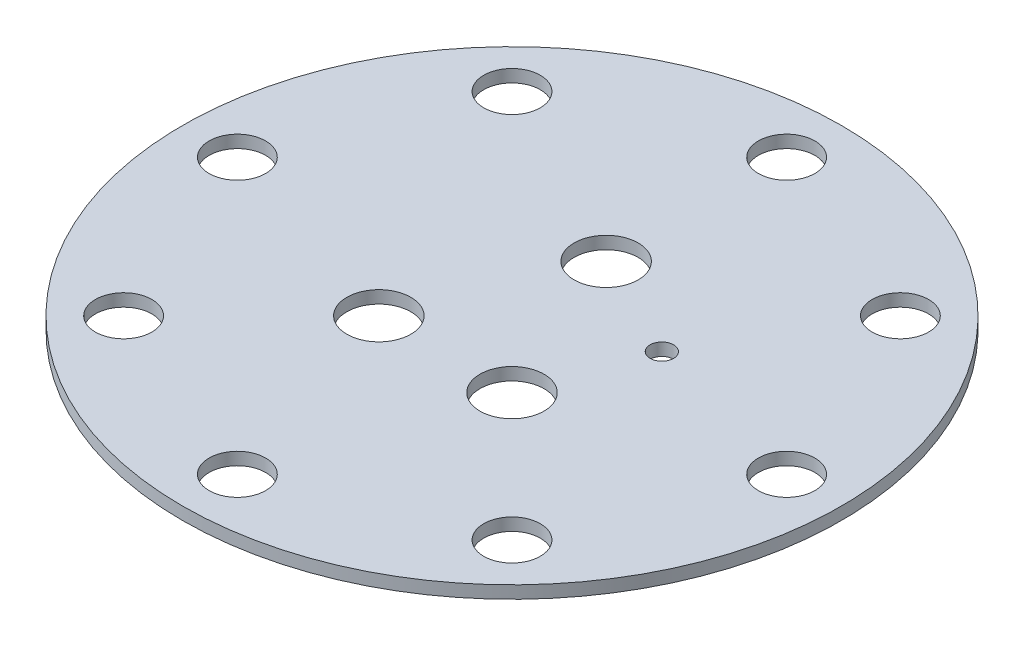
ISO-10303-21;
HEADER;
FILE_DESCRIPTION(('STEP AP214'),'2;1');
FILE_NAME('part.step','',(''),(''),'','','');
FILE_SCHEMA(('AUTOMOTIVE_DESIGN { 1 0 10303 214 1 1 1 1 }'));
ENDSEC;
DATA;
#1=APPLICATION_CONTEXT('core data for automotive mechanical design processes');
#2=APPLICATION_PROTOCOL_DEFINITION('international standard','automotive_design',2000,#1);
#3=PRODUCT_CONTEXT('',#1,'mechanical');
#4=PRODUCT('Part','Part','',(#3));
#5=PRODUCT_RELATED_PRODUCT_CATEGORY('part','',(#4));
#6=PRODUCT_DEFINITION_FORMATION('','',#4);
#7=PRODUCT_DEFINITION_CONTEXT('part definition',#1,'design');
#8=PRODUCT_DEFINITION('design','',#6,#7);
#9=PRODUCT_DEFINITION_SHAPE('','',#8);
#10=(LENGTH_UNIT() NAMED_UNIT(*) SI_UNIT(.MILLI.,.METRE.));
#11=(NAMED_UNIT(*) PLANE_ANGLE_UNIT() SI_UNIT($,.RADIAN.));
#12=(NAMED_UNIT(*) SI_UNIT($,.STERADIAN.) SOLID_ANGLE_UNIT());
#13=UNCERTAINTY_MEASURE_WITH_UNIT(LENGTH_MEASURE(1.E-05),#10,'distance_accuracy_value','');
#14=(GEOMETRIC_REPRESENTATION_CONTEXT(3) GLOBAL_UNCERTAINTY_ASSIGNED_CONTEXT((#13)) GLOBAL_UNIT_ASSIGNED_CONTEXT((#10,
#11,#12)) REPRESENTATION_CONTEXT('',''));
#15=CARTESIAN_POINT('',(0.,0.,0.));
#16=DIRECTION('',(0.,0.,1.));
#17=DIRECTION('',(1.,0.,0.));
#18=AXIS2_PLACEMENT_3D('',#15,#16,#17);
#19=CARTESIAN_POINT('',(0.,4.,0.));
#20=DIRECTION('',(0.,1.,0.));
#21=DIRECTION('',(0.,0.,1.));
#22=AXIS2_PLACEMENT_3D('',#19,#20,#21);
#23=PLANE('',#22);
#24=CARTESIAN_POINT('',(33.7600927369355,4.,-13.9838882786121));
#25=DIRECTION('',(0.,1.,0.));
#26=DIRECTION('',(0.,0.,1.));
#27=AXIS2_PLACEMENT_3D('',#24,#25,#26);
#28=CIRCLE('',#27,3.75000000000001);
#29=CARTESIAN_POINT('',(33.7600927369355,4.,-10.2338882786121));
#30=VERTEX_POINT('',#29);
#31=EDGE_CURVE('E103',#30,#30,#28,.T.);
#32=ORIENTED_EDGE('',*,*,#31,.F.);
#33=EDGE_LOOP('',(#32));
#34=FACE_BOUND('',#33,.T.);
#35=CARTESIAN_POINT('',(87.5000000000062,4.,0.));
#36=DIRECTION('',(0.,1.,0.));
#37=DIRECTION('',(0.,0.,1.));
#38=AXIS2_PLACEMENT_3D('',#35,#36,#37);
#39=CIRCLE('',#38,8.99999999999849);
#40=CARTESIAN_POINT('',(87.5000000000062,4.,8.99999999999849));
#41=VERTEX_POINT('',#40);
#42=EDGE_CURVE('E91',#41,#41,#39,.T.);
#43=ORIENTED_EDGE('',*,*,#42,.F.);
#44=EDGE_LOOP('',(#43));
#45=FACE_BOUND('',#44,.T.);
#46=CARTESIAN_POINT('',(6.22796459739364E-12,4.,87.5000000000062));
#47=DIRECTION('',(0.,1.,0.));
#48=DIRECTION('',(0.,0.,1.));
#49=AXIS2_PLACEMENT_3D('',#46,#47,#48);
#50=CIRCLE('',#49,9.00000000000473);
#51=CARTESIAN_POINT('',(6.22796459739364E-12,4.,96.5000000000109));
#52=VERTEX_POINT('',#51);
#53=EDGE_CURVE('E79',#52,#52,#50,.T.);
#54=ORIENTED_EDGE('',*,*,#53,.F.);
#55=EDGE_LOOP('',(#54));
#56=FACE_BOUND('',#55,.T.);
#57=CARTESIAN_POINT('',(-87.5,4.,6.21944463933198E-12));
#58=DIRECTION('',(0.,1.,0.));
#59=DIRECTION('',(0.,0.,1.));
#60=AXIS2_PLACEMENT_3D('',#57,#58,#59);
#61=CIRCLE('',#60,9.00000000000682);
#62=CARTESIAN_POINT('',(-87.5,4.,9.00000000001303));
#63=VERTEX_POINT('',#62);
#64=EDGE_CURVE('E67',#63,#63,#61,.T.);
#65=ORIENTED_EDGE('',*,*,#64,.F.);
#66=EDGE_LOOP('',(#65));
#67=FACE_BOUND('',#66,.T.);
#68=CARTESIAN_POINT('',(0.,4.,-87.5));
#69=DIRECTION('',(0.,1.,0.));
#70=DIRECTION('',(0.,0.,1.));
#71=AXIS2_PLACEMENT_3D('',#68,#69,#70);
#72=CIRCLE('',#71,8.99999999999999);
#73=CARTESIAN_POINT('',(0.,4.,-78.5));
#74=VERTEX_POINT('',#73);
#75=EDGE_CURVE('E55',#74,#74,#72,.T.);
#76=ORIENTED_EDGE('',*,*,#75,.F.);
#77=EDGE_LOOP('',(#76));
#78=FACE_BOUND('',#77,.T.);
#79=CARTESIAN_POINT('',(0.,4.,-30.));
#80=DIRECTION('',(0.,1.,0.));
#81=DIRECTION('',(0.,0.,1.));
#82=AXIS2_PLACEMENT_3D('',#79,#80,#81);
#83=CIRCLE('',#82,10.2);
#84=CARTESIAN_POINT('',(0.,4.,-19.8));
#85=VERTEX_POINT('',#84);
#86=EDGE_CURVE('E44',#85,#85,#83,.T.);
#87=ORIENTED_EDGE('',*,*,#86,.F.);
#88=EDGE_LOOP('',(#87));
#89=FACE_BOUND('',#88,.T.);
#90=CARTESIAN_POINT('',(0.,4.,0.));
#91=DIRECTION('',(0.,1.,0.));
#92=DIRECTION('',(0.,0.,1.));
#93=AXIS2_PLACEMENT_3D('',#90,#91,#92);
#94=CIRCLE('',#93,105.);
#95=CARTESIAN_POINT('',(0.,4.,105.));
#96=VERTEX_POINT('',#95);
#97=EDGE_CURVE('E10',#96,#96,#94,.T.);
#98=ORIENTED_EDGE('',*,*,#97,.T.);
#99=EDGE_LOOP('',(#98));
#100=FACE_BOUND('',#99,.T.);
#101=CARTESIAN_POINT('',(61.871843353826,4.,-61.8718433538242));
#102=DIRECTION('',(0.,1.,0.));
#103=DIRECTION('',(0.,0.,1.));
#104=AXIS2_PLACEMENT_3D('',#101,#102,#103);
#105=CIRCLE('',#104,8.99999999999801);
#106=CARTESIAN_POINT('',(61.871843353826,4.,-52.8718433538262));
#107=VERTEX_POINT('',#106);
#108=EDGE_CURVE('E49',#107,#107,#105,.T.);
#109=ORIENTED_EDGE('',*,*,#108,.F.);
#110=EDGE_LOOP('',(#109));
#111=FACE_BOUND('',#110,.T.);
#112=CARTESIAN_POINT('',(-61.8718433538242,4.,-61.8718433538198));
#113=DIRECTION('',(0.,1.,0.));
#114=DIRECTION('',(0.,0.,1.));
#115=AXIS2_PLACEMENT_3D('',#112,#113,#114);
#116=CIRCLE('',#115,9.00000000000437);
#117=CARTESIAN_POINT('',(-61.8718433538242,4.,-52.8718433538154));
#118=VERTEX_POINT('',#117);
#119=EDGE_CURVE('E61',#118,#118,#116,.T.);
#120=ORIENTED_EDGE('',*,*,#119,.F.);
#121=EDGE_LOOP('',(#120));
#122=FACE_BOUND('',#121,.T.);
#123=CARTESIAN_POINT('',(-61.8718433538198,4.,61.8718433538304));
#124=DIRECTION('',(0.,1.,0.));
#125=DIRECTION('',(0.,0.,1.));
#126=AXIS2_PLACEMENT_3D('',#123,#124,#125);
#127=CIRCLE('',#126,9.00000000000701);
#128=CARTESIAN_POINT('',(-61.8718433538198,4.,70.8718433538374));
#129=VERTEX_POINT('',#128);
#130=EDGE_CURVE('E73',#129,#129,#127,.T.);
#131=ORIENTED_EDGE('',*,*,#130,.F.);
#132=EDGE_LOOP('',(#131));
#133=FACE_BOUND('',#132,.T.);
#134=CARTESIAN_POINT('',(61.8718433538304,4.,61.871843353826));
#135=DIRECTION('',(0.,1.,0.));
#136=DIRECTION('',(0.,0.,1.));
#137=AXIS2_PLACEMENT_3D('',#134,#135,#136);
#138=CIRCLE('',#137,9.00000000000124);
#139=CARTESIAN_POINT('',(61.8718433538304,4.,70.8718433538272));
#140=VERTEX_POINT('',#139);
#141=EDGE_CURVE('E85',#140,#140,#138,.T.);
#142=ORIENTED_EDGE('',*,*,#141,.F.);
#143=EDGE_LOOP('',(#142));
#144=FACE_BOUND('',#143,.T.);
#145=CARTESIAN_POINT('',(-21.2132034355963,4.,21.2132034355965));
#146=DIRECTION('',(0.,1.,0.));
#147=DIRECTION('',(0.,0.,1.));
#148=AXIS2_PLACEMENT_3D('',#145,#146,#147);
#149=CIRCLE('',#148,10.2);
#150=CARTESIAN_POINT('',(-21.2132034355963,4.,31.4132034355965));
#151=VERTEX_POINT('',#150);
#152=EDGE_CURVE('E97',#151,#151,#149,.T.);
#153=ORIENTED_EDGE('',*,*,#152,.F.);
#154=EDGE_LOOP('',(#153));
#155=FACE_BOUND('',#154,.T.);
#156=CARTESIAN_POINT('',(21.2132034355963,4.,21.2132034355965));
#157=DIRECTION('',(0.,1.,0.));
#158=DIRECTION('',(0.,0.,1.));
#159=AXIS2_PLACEMENT_3D('',#156,#157,#158);
#160=CIRCLE('',#159,10.2);
#161=CARTESIAN_POINT('',(21.2132034355963,4.,31.4132034355965));
#162=VERTEX_POINT('',#161);
#163=EDGE_CURVE('E109',#162,#162,#160,.T.);
#164=ORIENTED_EDGE('',*,*,#163,.F.);
#165=EDGE_LOOP('',(#164));
#166=FACE_BOUND('',#165,.T.);
#167=ADVANCED_FACE('F33',(#34,#45,#56,#67,#78,#89,#100,#111,#122,#133,#144,#155,#166),#23,.T.);
#168=CARTESIAN_POINT('',(0.,0.,0.));
#169=DIRECTION('',(0.,1.,0.));
#170=DIRECTION('',(0.,0.,1.));
#171=AXIS2_PLACEMENT_3D('',#168,#169,#170);
#172=PLANE('',#171);
#173=CARTESIAN_POINT('',(0.,0.,0.));
#174=DIRECTION('',(0.,1.,0.));
#175=DIRECTION('',(0.,0.,1.));
#176=AXIS2_PLACEMENT_3D('',#173,#174,#175);
#177=CIRCLE('',#176,105.);
#178=CARTESIAN_POINT('',(0.,0.,105.));
#179=VERTEX_POINT('',#178);
#180=EDGE_CURVE('E37',#179,#179,#177,.T.);
#181=ORIENTED_EDGE('',*,*,#180,.F.);
#182=EDGE_LOOP('',(#181));
#183=FACE_BOUND('',#182,.T.);
#184=CARTESIAN_POINT('',(0.,0.,-30.));
#185=DIRECTION('',(0.,1.,0.));
#186=DIRECTION('',(0.,0.,1.));
#187=AXIS2_PLACEMENT_3D('',#184,#185,#186);
#188=CIRCLE('',#187,10.2);
#189=CARTESIAN_POINT('',(0.,0.,-19.8));
#190=VERTEX_POINT('',#189);
#191=EDGE_CURVE('E46',#190,#190,#188,.T.);
#192=ORIENTED_EDGE('',*,*,#191,.T.);
#193=EDGE_LOOP('',(#192));
#194=FACE_BOUND('',#193,.T.);
#195=CARTESIAN_POINT('',(61.871843353826,0.,-61.8718433538242));
#196=DIRECTION('',(0.,1.,0.));
#197=DIRECTION('',(0.,0.,1.));
#198=AXIS2_PLACEMENT_3D('',#195,#196,#197);
#199=CIRCLE('',#198,8.99999999999801);
#200=CARTESIAN_POINT('',(61.871843353826,0.,-52.8718433538262));
#201=VERTEX_POINT('',#200);
#202=EDGE_CURVE('E52',#201,#201,#199,.T.);
#203=ORIENTED_EDGE('',*,*,#202,.T.);
#204=EDGE_LOOP('',(#203));
#205=FACE_BOUND('',#204,.T.);
#206=CARTESIAN_POINT('',(0.,0.,-87.5));
#207=DIRECTION('',(0.,1.,0.));
#208=DIRECTION('',(0.,0.,1.));
#209=AXIS2_PLACEMENT_3D('',#206,#207,#208);
#210=CIRCLE('',#209,8.99999999999999);
#211=CARTESIAN_POINT('',(0.,0.,-78.5));
#212=VERTEX_POINT('',#211);
#213=EDGE_CURVE('E58',#212,#212,#210,.T.);
#214=ORIENTED_EDGE('',*,*,#213,.T.);
#215=EDGE_LOOP('',(#214));
#216=FACE_BOUND('',#215,.T.);
#217=CARTESIAN_POINT('',(-61.8718433538242,0.,-61.8718433538198));
#218=DIRECTION('',(0.,1.,0.));
#219=DIRECTION('',(0.,0.,1.));
#220=AXIS2_PLACEMENT_3D('',#217,#218,#219);
#221=CIRCLE('',#220,9.00000000000437);
#222=CARTESIAN_POINT('',(-61.8718433538242,0.,-52.8718433538154));
#223=VERTEX_POINT('',#222);
#224=EDGE_CURVE('E64',#223,#223,#221,.T.);
#225=ORIENTED_EDGE('',*,*,#224,.T.);
#226=EDGE_LOOP('',(#225));
#227=FACE_BOUND('',#226,.T.);
#228=CARTESIAN_POINT('',(-87.5,0.,6.21944463933198E-12));
#229=DIRECTION('',(0.,1.,0.));
#230=DIRECTION('',(0.,0.,1.));
#231=AXIS2_PLACEMENT_3D('',#228,#229,#230);
#232=CIRCLE('',#231,9.00000000000682);
#233=CARTESIAN_POINT('',(-87.5,0.,9.00000000001303));
#234=VERTEX_POINT('',#233);
#235=EDGE_CURVE('E70',#234,#234,#232,.T.);
#236=ORIENTED_EDGE('',*,*,#235,.T.);
#237=EDGE_LOOP('',(#236));
#238=FACE_BOUND('',#237,.T.);
#239=CARTESIAN_POINT('',(-61.8718433538198,0.,61.8718433538304));
#240=DIRECTION('',(0.,1.,0.));
#241=DIRECTION('',(0.,0.,1.));
#242=AXIS2_PLACEMENT_3D('',#239,#240,#241);
#243=CIRCLE('',#242,9.00000000000701);
#244=CARTESIAN_POINT('',(-61.8718433538198,0.,70.8718433538374));
#245=VERTEX_POINT('',#244);
#246=EDGE_CURVE('E76',#245,#245,#243,.T.);
#247=ORIENTED_EDGE('',*,*,#246,.T.);
#248=EDGE_LOOP('',(#247));
#249=FACE_BOUND('',#248,.T.);
#250=CARTESIAN_POINT('',(6.22796459739364E-12,0.,87.5000000000062));
#251=DIRECTION('',(0.,1.,0.));
#252=DIRECTION('',(0.,0.,1.));
#253=AXIS2_PLACEMENT_3D('',#250,#251,#252);
#254=CIRCLE('',#253,9.00000000000473);
#255=CARTESIAN_POINT('',(6.22796459739364E-12,0.,96.5000000000109));
#256=VERTEX_POINT('',#255);
#257=EDGE_CURVE('E82',#256,#256,#254,.T.);
#258=ORIENTED_EDGE('',*,*,#257,.T.);
#259=EDGE_LOOP('',(#258));
#260=FACE_BOUND('',#259,.T.);
#261=CARTESIAN_POINT('',(61.8718433538304,0.,61.871843353826));
#262=DIRECTION('',(0.,1.,0.));
#263=DIRECTION('',(0.,0.,1.));
#264=AXIS2_PLACEMENT_3D('',#261,#262,#263);
#265=CIRCLE('',#264,9.00000000000124);
#266=CARTESIAN_POINT('',(61.8718433538304,0.,70.8718433538272));
#267=VERTEX_POINT('',#266);
#268=EDGE_CURVE('E88',#267,#267,#265,.T.);
#269=ORIENTED_EDGE('',*,*,#268,.T.);
#270=EDGE_LOOP('',(#269));
#271=FACE_BOUND('',#270,.T.);
#272=CARTESIAN_POINT('',(87.5000000000062,0.,0.));
#273=DIRECTION('',(0.,1.,0.));
#274=DIRECTION('',(0.,0.,1.));
#275=AXIS2_PLACEMENT_3D('',#272,#273,#274);
#276=CIRCLE('',#275,8.99999999999849);
#277=CARTESIAN_POINT('',(87.5000000000062,0.,8.99999999999849));
#278=VERTEX_POINT('',#277);
#279=EDGE_CURVE('E94',#278,#278,#276,.T.);
#280=ORIENTED_EDGE('',*,*,#279,.T.);
#281=EDGE_LOOP('',(#280));
#282=FACE_BOUND('',#281,.T.);
#283=CARTESIAN_POINT('',(-21.2132034355963,0.,21.2132034355965));
#284=DIRECTION('',(0.,1.,0.));
#285=DIRECTION('',(0.,0.,1.));
#286=AXIS2_PLACEMENT_3D('',#283,#284,#285);
#287=CIRCLE('',#286,10.2);
#288=CARTESIAN_POINT('',(-21.2132034355963,0.,31.4132034355965));
#289=VERTEX_POINT('',#288);
#290=EDGE_CURVE('E100',#289,#289,#287,.T.);
#291=ORIENTED_EDGE('',*,*,#290,.T.);
#292=EDGE_LOOP('',(#291));
#293=FACE_BOUND('',#292,.T.);
#294=CARTESIAN_POINT('',(33.7600927369355,0.,-13.9838882786121));
#295=DIRECTION('',(0.,1.,0.));
#296=DIRECTION('',(0.,0.,1.));
#297=AXIS2_PLACEMENT_3D('',#294,#295,#296);
#298=CIRCLE('',#297,3.75000000000001);
#299=CARTESIAN_POINT('',(33.7600927369355,0.,-10.2338882786121));
#300=VERTEX_POINT('',#299);
#301=EDGE_CURVE('E106',#300,#300,#298,.T.);
#302=ORIENTED_EDGE('',*,*,#301,.T.);
#303=EDGE_LOOP('',(#302));
#304=FACE_BOUND('',#303,.T.);
#305=CARTESIAN_POINT('',(21.2132034355963,0.,21.2132034355965));
#306=DIRECTION('',(0.,1.,0.));
#307=DIRECTION('',(0.,0.,1.));
#308=AXIS2_PLACEMENT_3D('',#305,#306,#307);
#309=CIRCLE('',#308,10.2);
#310=CARTESIAN_POINT('',(21.2132034355963,0.,31.4132034355965));
#311=VERTEX_POINT('',#310);
#312=EDGE_CURVE('E112',#311,#311,#309,.T.);
#313=ORIENTED_EDGE('',*,*,#312,.T.);
#314=EDGE_LOOP('',(#313));
#315=FACE_BOUND('',#314,.T.);
#316=ADVANCED_FACE('F122',(#183,#194,#205,#216,#227,#238,#249,#260,#271,#282,#293,#304,#315),
#172,.F.);
#317=CARTESIAN_POINT('',(0.,4.,0.));
#318=DIRECTION('',(0.,-1.,0.));
#319=DIRECTION('',(0.,0.,-1.));
#320=AXIS2_PLACEMENT_3D('',#317,#318,#319);
#321=CYLINDRICAL_SURFACE('',#320,105.);
#322=ORIENTED_EDGE('',*,*,#97,.F.);
#323=EDGE_LOOP('',(#322));
#324=FACE_BOUND('',#323,.T.);
#325=ORIENTED_EDGE('',*,*,#180,.T.);
#326=EDGE_LOOP('',(#325));
#327=FACE_BOUND('',#326,.T.);
#328=ADVANCED_FACE('F35',(#324,#327),#321,.T.);
#329=CARTESIAN_POINT('',(0.,4.,-30.));
#330=DIRECTION('',(0.,-1.,0.));
#331=DIRECTION('',(0.,0.,-1.));
#332=AXIS2_PLACEMENT_3D('',#329,#330,#331);
#333=CYLINDRICAL_SURFACE('',#332,10.2);
#334=ORIENTED_EDGE('',*,*,#86,.T.);
#335=EDGE_LOOP('',(#334));
#336=FACE_BOUND('',#335,.T.);
#337=ORIENTED_EDGE('',*,*,#191,.F.);
#338=EDGE_LOOP('',(#337));
#339=FACE_BOUND('',#338,.T.);
#340=ADVANCED_FACE('F132',(#336,#339),#333,.F.);
#341=CARTESIAN_POINT('',(61.871843353826,4.,-61.8718433538242));
#342=DIRECTION('',(0.,-1.,0.));
#343=DIRECTION('',(0.,0.,-1.));
#344=AXIS2_PLACEMENT_3D('',#341,#342,#343);
#345=CYLINDRICAL_SURFACE('',#344,8.99999999999801);
#346=ORIENTED_EDGE('',*,*,#108,.T.);
#347=EDGE_LOOP('',(#346));
#348=FACE_BOUND('',#347,.T.);
#349=ORIENTED_EDGE('',*,*,#202,.F.);
#350=EDGE_LOOP('',(#349));
#351=FACE_BOUND('',#350,.T.);
#352=ADVANCED_FACE('F135',(#348,#351),#345,.F.);
#353=CARTESIAN_POINT('',(0.,4.,-87.5));
#354=DIRECTION('',(0.,-1.,0.));
#355=DIRECTION('',(0.,0.,-1.));
#356=AXIS2_PLACEMENT_3D('',#353,#354,#355);
#357=CYLINDRICAL_SURFACE('',#356,8.99999999999999);
#358=ORIENTED_EDGE('',*,*,#75,.T.);
#359=EDGE_LOOP('',(#358));
#360=FACE_BOUND('',#359,.T.);
#361=ORIENTED_EDGE('',*,*,#213,.F.);
#362=EDGE_LOOP('',(#361));
#363=FACE_BOUND('',#362,.T.);
#364=ADVANCED_FACE('F139',(#360,#363),#357,.F.);
#365=CARTESIAN_POINT('',(-61.8718433538242,4.,-61.8718433538198));
#366=DIRECTION('',(0.,-1.,0.));
#367=DIRECTION('',(0.,0.,-1.));
#368=AXIS2_PLACEMENT_3D('',#365,#366,#367);
#369=CYLINDRICAL_SURFACE('',#368,9.00000000000437);
#370=ORIENTED_EDGE('',*,*,#119,.T.);
#371=EDGE_LOOP('',(#370));
#372=FACE_BOUND('',#371,.T.);
#373=ORIENTED_EDGE('',*,*,#224,.F.);
#374=EDGE_LOOP('',(#373));
#375=FACE_BOUND('',#374,.T.);
#376=ADVANCED_FACE('F143',(#372,#375),#369,.F.);
#377=CARTESIAN_POINT('',(-87.5,4.,6.21944463933198E-12));
#378=DIRECTION('',(0.,-1.,0.));
#379=DIRECTION('',(0.,0.,-1.));
#380=AXIS2_PLACEMENT_3D('',#377,#378,#379);
#381=CYLINDRICAL_SURFACE('',#380,9.00000000000682);
#382=ORIENTED_EDGE('',*,*,#64,.T.);
#383=EDGE_LOOP('',(#382));
#384=FACE_BOUND('',#383,.T.);
#385=ORIENTED_EDGE('',*,*,#235,.F.);
#386=EDGE_LOOP('',(#385));
#387=FACE_BOUND('',#386,.T.);
#388=ADVANCED_FACE('F147',(#384,#387),#381,.F.);
#389=CARTESIAN_POINT('',(-61.8718433538198,4.,61.8718433538304));
#390=DIRECTION('',(0.,-1.,0.));
#391=DIRECTION('',(0.,0.,-1.));
#392=AXIS2_PLACEMENT_3D('',#389,#390,#391);
#393=CYLINDRICAL_SURFACE('',#392,9.00000000000701);
#394=ORIENTED_EDGE('',*,*,#130,.T.);
#395=EDGE_LOOP('',(#394));
#396=FACE_BOUND('',#395,.T.);
#397=ORIENTED_EDGE('',*,*,#246,.F.);
#398=EDGE_LOOP('',(#397));
#399=FACE_BOUND('',#398,.T.);
#400=ADVANCED_FACE('F151',(#396,#399),#393,.F.);
#401=CARTESIAN_POINT('',(6.22796459739364E-12,4.,87.5000000000062));
#402=DIRECTION('',(0.,-1.,0.));
#403=DIRECTION('',(0.,0.,-1.));
#404=AXIS2_PLACEMENT_3D('',#401,#402,#403);
#405=CYLINDRICAL_SURFACE('',#404,9.00000000000473);
#406=ORIENTED_EDGE('',*,*,#53,.T.);
#407=EDGE_LOOP('',(#406));
#408=FACE_BOUND('',#407,.T.);
#409=ORIENTED_EDGE('',*,*,#257,.F.);
#410=EDGE_LOOP('',(#409));
#411=FACE_BOUND('',#410,.T.);
#412=ADVANCED_FACE('F155',(#408,#411),#405,.F.);
#413=CARTESIAN_POINT('',(61.8718433538304,4.,61.871843353826));
#414=DIRECTION('',(0.,-1.,0.));
#415=DIRECTION('',(0.,0.,-1.));
#416=AXIS2_PLACEMENT_3D('',#413,#414,#415);
#417=CYLINDRICAL_SURFACE('',#416,9.00000000000124);
#418=ORIENTED_EDGE('',*,*,#141,.T.);
#419=EDGE_LOOP('',(#418));
#420=FACE_BOUND('',#419,.T.);
#421=ORIENTED_EDGE('',*,*,#268,.F.);
#422=EDGE_LOOP('',(#421));
#423=FACE_BOUND('',#422,.T.);
#424=ADVANCED_FACE('F159',(#420,#423),#417,.F.);
#425=CARTESIAN_POINT('',(87.5000000000062,4.,0.));
#426=DIRECTION('',(0.,-1.,0.));
#427=DIRECTION('',(0.,0.,-1.));
#428=AXIS2_PLACEMENT_3D('',#425,#426,#427);
#429=CYLINDRICAL_SURFACE('',#428,8.99999999999849);
#430=ORIENTED_EDGE('',*,*,#42,.T.);
#431=EDGE_LOOP('',(#430));
#432=FACE_BOUND('',#431,.T.);
#433=ORIENTED_EDGE('',*,*,#279,.F.);
#434=EDGE_LOOP('',(#433));
#435=FACE_BOUND('',#434,.T.);
#436=ADVANCED_FACE('F163',(#432,#435),#429,.F.);
#437=CARTESIAN_POINT('',(-21.2132034355963,4.,21.2132034355965));
#438=DIRECTION('',(0.,-1.,0.));
#439=DIRECTION('',(0.,0.,-1.));
#440=AXIS2_PLACEMENT_3D('',#437,#438,#439);
#441=CYLINDRICAL_SURFACE('',#440,10.2);
#442=ORIENTED_EDGE('',*,*,#152,.T.);
#443=EDGE_LOOP('',(#442));
#444=FACE_BOUND('',#443,.T.);
#445=ORIENTED_EDGE('',*,*,#290,.F.);
#446=EDGE_LOOP('',(#445));
#447=FACE_BOUND('',#446,.T.);
#448=ADVANCED_FACE('F167',(#444,#447),#441,.F.);
#449=CARTESIAN_POINT('',(33.7600927369355,4.,-13.9838882786121));
#450=DIRECTION('',(0.,-1.,0.));
#451=DIRECTION('',(0.,0.,-1.));
#452=AXIS2_PLACEMENT_3D('',#449,#450,#451);
#453=CYLINDRICAL_SURFACE('',#452,3.75000000000001);
#454=ORIENTED_EDGE('',*,*,#31,.T.);
#455=EDGE_LOOP('',(#454));
#456=FACE_BOUND('',#455,.T.);
#457=ORIENTED_EDGE('',*,*,#301,.F.);
#458=EDGE_LOOP('',(#457));
#459=FACE_BOUND('',#458,.T.);
#460=ADVANCED_FACE('F171',(#456,#459),#453,.F.);
#461=CARTESIAN_POINT('',(21.2132034355963,4.,21.2132034355965));
#462=DIRECTION('',(0.,-1.,0.));
#463=DIRECTION('',(0.,0.,-1.));
#464=AXIS2_PLACEMENT_3D('',#461,#462,#463);
#465=CYLINDRICAL_SURFACE('',#464,10.2);
#466=ORIENTED_EDGE('',*,*,#163,.T.);
#467=EDGE_LOOP('',(#466));
#468=FACE_BOUND('',#467,.T.);
#469=ORIENTED_EDGE('',*,*,#312,.F.);
#470=EDGE_LOOP('',(#469));
#471=FACE_BOUND('',#470,.T.);
#472=ADVANCED_FACE('F118',(#468,#471),#465,.F.);
#473=CLOSED_SHELL('',(#167,#316,#328,#340,#352,#364,#376,#388,#400,#412,#424,#436,#448,#460,#472));
#474=MANIFOLD_SOLID_BREP('B2',#473);
#475=ADVANCED_BREP_SHAPE_REPRESENTATION('',(#18,#474),#14);
#476=SHAPE_DEFINITION_REPRESENTATION(#9,#475);
ENDSEC;
END-ISO-10303-21;
